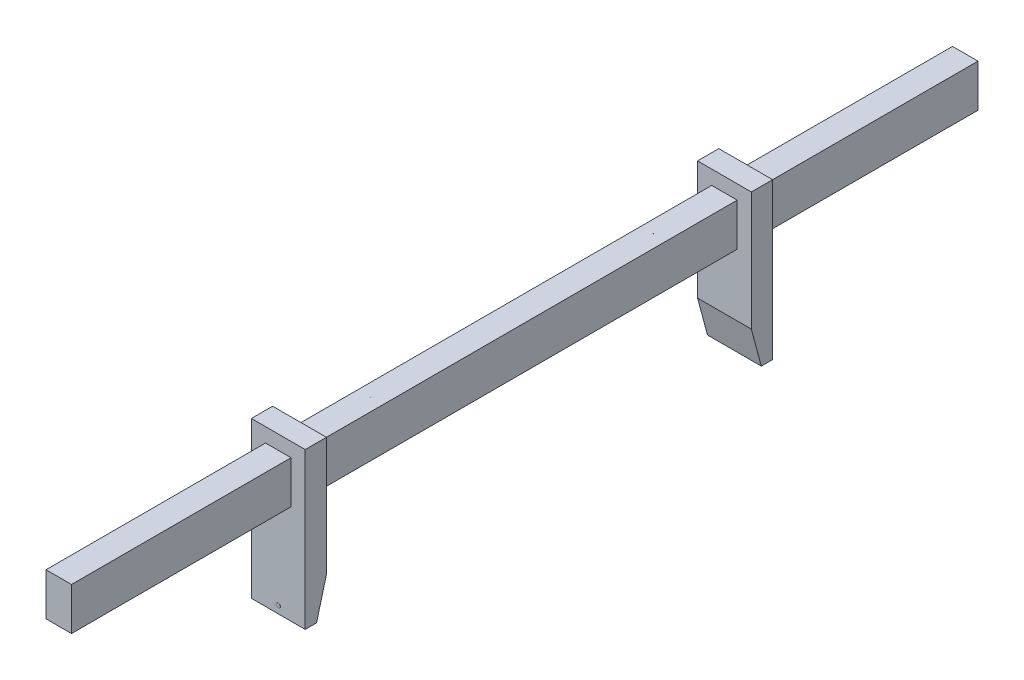
ISO-10303-21;
HEADER;
FILE_DESCRIPTION(('STEP AP214'),'2;1');
FILE_NAME('part.step','',(''),(''),'','','');
FILE_SCHEMA(('AUTOMOTIVE_DESIGN { 1 0 10303 214 1 1 1 1 }'));
ENDSEC;
DATA;
#1=APPLICATION_CONTEXT('core data for automotive mechanical design processes');
#2=APPLICATION_PROTOCOL_DEFINITION('international standard','automotive_design',2000,#1);
#3=PRODUCT_CONTEXT('',#1,'mechanical');
#4=PRODUCT('Part','Part','',(#3));
#5=PRODUCT_RELATED_PRODUCT_CATEGORY('part','',(#4));
#6=PRODUCT_DEFINITION_FORMATION('','',#4);
#7=PRODUCT_DEFINITION_CONTEXT('part definition',#1,'design');
#8=PRODUCT_DEFINITION('design','',#6,#7);
#9=PRODUCT_DEFINITION_SHAPE('','',#8);
#10=(LENGTH_UNIT() NAMED_UNIT(*) SI_UNIT(.MILLI.,.METRE.));
#11=(NAMED_UNIT(*) PLANE_ANGLE_UNIT() SI_UNIT($,.RADIAN.));
#12=(NAMED_UNIT(*) SI_UNIT($,.STERADIAN.) SOLID_ANGLE_UNIT());
#13=UNCERTAINTY_MEASURE_WITH_UNIT(LENGTH_MEASURE(1.E-05),#10,'distance_accuracy_value','');
#14=(GEOMETRIC_REPRESENTATION_CONTEXT(3) GLOBAL_UNCERTAINTY_ASSIGNED_CONTEXT((#13)) GLOBAL_UNIT_ASSIGNED_CONTEXT((#10,
#11,#12)) REPRESENTATION_CONTEXT('',''));
#15=CARTESIAN_POINT('',(0.,0.,0.));
#16=DIRECTION('',(0.,0.,1.));
#17=DIRECTION('',(1.,0.,0.));
#18=AXIS2_PLACEMENT_3D('',#15,#16,#17);
#19=CARTESIAN_POINT('',(9.,-15.,300.));
#20=DIRECTION('',(-1.,0.,0.));
#21=DIRECTION('',(0.,0.,1.));
#22=AXIS2_PLACEMENT_3D('',#19,#20,#21);
#23=PLANE('',#22);
#24=DIRECTION('',(0.,-1.,0.));
#25=VECTOR('',#24,1.);
#26=CARTESIAN_POINT('',(9.,-15.,-150.));
#27=LINE('',#26,#25);
#28=CARTESIAN_POINT('',(9.,15.,-150.));
#29=VERTEX_POINT('',#28);
#30=CARTESIAN_POINT('',(9.,-15.,-150.));
#31=VERTEX_POINT('',#30);
#32=EDGE_CURVE('E64',#29,#31,#27,.T.);
#33=ORIENTED_EDGE('',*,*,#32,.F.);
#34=DIRECTION('',(0.,0.,-1.));
#35=VECTOR('',#34,1.);
#36=CARTESIAN_POINT('',(9.,15.,300.));
#37=LINE('',#36,#35);
#38=CARTESIAN_POINT('',(9.,15.,150.));
#39=VERTEX_POINT('',#38);
#40=EDGE_CURVE('E416',#39,#29,#37,.T.);
#41=ORIENTED_EDGE('',*,*,#40,.F.);
#42=DIRECTION('',(0.,-1.,0.));
#43=VECTOR('',#42,1.);
#44=CARTESIAN_POINT('',(9.,-15.,150.));
#45=LINE('',#44,#43);
#46=CARTESIAN_POINT('',(9.,-15.,150.));
#47=VERTEX_POINT('',#46);
#48=EDGE_CURVE('E339',#39,#47,#45,.T.);
#49=ORIENTED_EDGE('',*,*,#48,.T.);
#50=DIRECTION('',(0.,0.,-1.));
#51=VECTOR('',#50,1.);
#52=CARTESIAN_POINT('',(9.,-15.,300.));
#53=LINE('',#52,#51);
#54=EDGE_CURVE('E401',#47,#31,#53,.T.);
#55=ORIENTED_EDGE('',*,*,#54,.T.);
#56=EDGE_LOOP('',(#33,#41,#49,#55));
#57=FACE_BOUND('',#56,.T.);
#58=ADVANCED_FACE('F41',(#57),#23,.F.);
#59=CARTESIAN_POINT('',(-9.,15.,300.));
#60=DIRECTION('',(0.,-1.,0.));
#61=DIRECTION('',(0.,0.,-1.));
#62=AXIS2_PLACEMENT_3D('',#59,#60,#61);
#63=PLANE('',#62);
#64=CARTESIAN_POINT('',(0.,15.,100.));
#65=DIRECTION('',(0.,-1.,0.));
#66=DIRECTION('',(0.,0.,-1.));
#67=AXIS2_PLACEMENT_3D('',#64,#65,#66);
#68=CIRCLE('',#67,0.25);
#69=CARTESIAN_POINT('',(0.,15.,99.75));
#70=VERTEX_POINT('',#69);
#71=EDGE_CURVE('E612',#70,#70,#68,.T.);
#72=ORIENTED_EDGE('',*,*,#71,.T.);
#73=EDGE_LOOP('',(#72));
#74=FACE_BOUND('',#73,.T.);
#75=CARTESIAN_POINT('',(0.,15.,-100.));
#76=DIRECTION('',(0.,-1.,0.));
#77=DIRECTION('',(0.,0.,-1.));
#78=AXIS2_PLACEMENT_3D('',#75,#76,#77);
#79=CIRCLE('',#78,0.25);
#80=CARTESIAN_POINT('',(0.,15.,-100.25));
#81=VERTEX_POINT('',#80);
#82=EDGE_CURVE('E11',#81,#81,#79,.F.);
#83=ORIENTED_EDGE('',*,*,#82,.F.);
#84=EDGE_LOOP('',(#83));
#85=FACE_BOUND('',#84,.T.);
#86=DIRECTION('',(1.,0.,0.));
#87=VECTOR('',#86,1.);
#88=CARTESIAN_POINT('',(-9.,15.,-150.));
#89=LINE('',#88,#87);
#90=CARTESIAN_POINT('',(-9.,15.,-150.));
#91=VERTEX_POINT('',#90);
#92=EDGE_CURVE('E273',#91,#29,#89,.T.);
#93=ORIENTED_EDGE('',*,*,#92,.F.);
#94=DIRECTION('',(0.,0.,-1.));
#95=VECTOR('',#94,1.);
#96=CARTESIAN_POINT('',(-9.,15.,300.));
#97=LINE('',#96,#95);
#98=CARTESIAN_POINT('',(-9.,15.,150.));
#99=VERTEX_POINT('',#98);
#100=EDGE_CURVE('E411',#99,#91,#97,.T.);
#101=ORIENTED_EDGE('',*,*,#100,.F.);
#102=DIRECTION('',(1.,0.,0.));
#103=VECTOR('',#102,1.);
#104=CARTESIAN_POINT('',(-9.,15.,150.));
#105=LINE('',#104,#103);
#106=EDGE_CURVE('E336',#99,#39,#105,.T.);
#107=ORIENTED_EDGE('',*,*,#106,.T.);
#108=ORIENTED_EDGE('',*,*,#40,.T.);
#109=EDGE_LOOP('',(#93,#101,#107,#108));
#110=FACE_BOUND('',#109,.T.);
#111=ADVANCED_FACE('F445',(#74,#85,#110),#63,.F.);
#112=CARTESIAN_POINT('',(-9.,-15.,300.));
#113=DIRECTION('',(1.,0.,0.));
#114=DIRECTION('',(0.,0.,-1.));
#115=AXIS2_PLACEMENT_3D('',#112,#113,#114);
#116=PLANE('',#115);
#117=DIRECTION('',(0.,1.,0.));
#118=VECTOR('',#117,1.);
#119=CARTESIAN_POINT('',(-9.,-15.,-150.));
#120=LINE('',#119,#118);
#121=CARTESIAN_POINT('',(-9.,-15.,-150.));
#122=VERTEX_POINT('',#121);
#123=EDGE_CURVE('E263',#122,#91,#120,.T.);
#124=ORIENTED_EDGE('',*,*,#123,.F.);
#125=DIRECTION('',(0.,0.,-1.));
#126=VECTOR('',#125,1.);
#127=CARTESIAN_POINT('',(-9.,-15.,300.));
#128=LINE('',#127,#126);
#129=CARTESIAN_POINT('',(-9.,-15.,150.));
#130=VERTEX_POINT('',#129);
#131=EDGE_CURVE('E406',#130,#122,#128,.T.);
#132=ORIENTED_EDGE('',*,*,#131,.F.);
#133=DIRECTION('',(0.,1.,0.));
#134=VECTOR('',#133,1.);
#135=CARTESIAN_POINT('',(-9.,-15.,150.));
#136=LINE('',#135,#134);
#137=EDGE_CURVE('E333',#130,#99,#136,.T.);
#138=ORIENTED_EDGE('',*,*,#137,.T.);
#139=ORIENTED_EDGE('',*,*,#100,.T.);
#140=EDGE_LOOP('',(#124,#132,#138,#139));
#141=FACE_BOUND('',#140,.T.);
#142=ADVANCED_FACE('F442',(#141),#116,.F.);
#143=CARTESIAN_POINT('',(-9.,-15.,300.));
#144=DIRECTION('',(0.,1.,0.));
#145=DIRECTION('',(0.,0.,1.));
#146=AXIS2_PLACEMENT_3D('',#143,#144,#145);
#147=PLANE('',#146);
#148=DIRECTION('',(-1.,0.,0.));
#149=VECTOR('',#148,1.);
#150=CARTESIAN_POINT('',(-9.,-15.,-150.));
#151=LINE('',#150,#149);
#152=EDGE_CURVE('E422',#31,#122,#151,.T.);
#153=ORIENTED_EDGE('',*,*,#152,.F.);
#154=ORIENTED_EDGE('',*,*,#54,.F.);
#155=DIRECTION('',(-1.,0.,0.));
#156=VECTOR('',#155,1.);
#157=CARTESIAN_POINT('',(-9.,-15.,150.));
#158=LINE('',#157,#156);
#159=EDGE_CURVE('E419',#47,#130,#158,.T.);
#160=ORIENTED_EDGE('',*,*,#159,.T.);
#161=ORIENTED_EDGE('',*,*,#131,.T.);
#162=EDGE_LOOP('',(#153,#154,#160,#161));
#163=FACE_BOUND('',#162,.T.);
#164=ADVANCED_FACE('F438',(#163),#147,.F.);
#165=CARTESIAN_POINT('',(-19.,-58.8756443470172,150.));
#166=DIRECTION('',(0.,0.,-1.));
#167=DIRECTION('',(-1.,0.,0.));
#168=AXIS2_PLACEMENT_3D('',#165,#166,#167);
#169=PLANE('',#168);
#170=DIRECTION('',(0.,1.,0.));
#171=VECTOR('',#170,1.);
#172=CARTESIAN_POINT('',(19.,-58.8756443470172,150.));
#173=LINE('',#172,#171);
#174=CARTESIAN_POINT('',(19.,-58.8756443470172,150.));
#175=VERTEX_POINT('',#174);
#176=CARTESIAN_POINT('',(19.,25.,150.));
#177=VERTEX_POINT('',#176);
#178=EDGE_CURVE('E289',#175,#177,#173,.T.);
#179=ORIENTED_EDGE('',*,*,#178,.F.);
#180=DIRECTION('',(1.,0.,0.));
#181=VECTOR('',#180,1.);
#182=CARTESIAN_POINT('',(-19.,-58.8756443470172,150.));
#183=LINE('',#182,#181);
#184=CARTESIAN_POINT('',(-19.,-58.8756443470172,150.));
#185=VERTEX_POINT('',#184);
#186=EDGE_CURVE('E318',#185,#175,#183,.T.);
#187=ORIENTED_EDGE('',*,*,#186,.F.);
#188=DIRECTION('',(0.,1.,0.));
#189=VECTOR('',#188,1.);
#190=CARTESIAN_POINT('',(-19.,-58.8756443470172,150.));
#191=LINE('',#190,#189);
#192=CARTESIAN_POINT('',(-19.,25.,150.));
#193=VERTEX_POINT('',#192);
#194=EDGE_CURVE('E298',#185,#193,#191,.T.);
#195=ORIENTED_EDGE('',*,*,#194,.T.);
#196=DIRECTION('',(1.,0.,0.));
#197=VECTOR('',#196,1.);
#198=CARTESIAN_POINT('',(-19.,25.,150.));
#199=LINE('',#198,#197);
#200=EDGE_CURVE('E315',#193,#177,#199,.T.);
#201=ORIENTED_EDGE('',*,*,#200,.T.);
#202=EDGE_LOOP('',(#179,#187,#195,#201));
#203=FACE_BOUND('',#202,.T.);
#204=ORIENTED_EDGE('',*,*,#48,.F.);
#205=ORIENTED_EDGE('',*,*,#106,.F.);
#206=ORIENTED_EDGE('',*,*,#137,.F.);
#207=ORIENTED_EDGE('',*,*,#159,.F.);
#208=EDGE_LOOP('',(#204,#205,#206,#207));
#209=FACE_BOUND('',#208,.T.);
#210=ADVANCED_FACE('F520',(#203,#209),#169,.T.);
#211=CARTESIAN_POINT('',(-19.,25.,165.));
#212=DIRECTION('',(0.,0.,1.));
#213=DIRECTION('',(1.,0.,0.));
#214=AXIS2_PLACEMENT_3D('',#211,#212,#213);
#215=PLANE('',#214);
#216=CARTESIAN_POINT('',(0.,-79.8368161757076,165.));
#217=DIRECTION('',(0.,0.,1.));
#218=DIRECTION('',(1.,0.,0.));
#219=AXIS2_PLACEMENT_3D('',#216,#217,#218);
#220=CIRCLE('',#219,1.5);
#221=CARTESIAN_POINT('',(1.5,-79.8368161757076,165.));
#222=VERTEX_POINT('',#221);
#223=EDGE_CURVE('E602',#222,#222,#220,.T.);
#224=ORIENTED_EDGE('',*,*,#223,.F.);
#225=EDGE_LOOP('',(#224));
#226=FACE_BOUND('',#225,.T.);
#227=DIRECTION('',(0.,-1.,0.));
#228=VECTOR('',#227,1.);
#229=CARTESIAN_POINT('',(19.,25.,165.));
#230=LINE('',#229,#228);
#231=CARTESIAN_POINT('',(19.,25.,165.));
#232=VERTEX_POINT('',#231);
#233=CARTESIAN_POINT('',(19.,-85.,165.));
#234=VERTEX_POINT('',#233);
#235=EDGE_CURVE('E304',#232,#234,#230,.T.);
#236=ORIENTED_EDGE('',*,*,#235,.F.);
#237=DIRECTION('',(1.,0.,0.));
#238=VECTOR('',#237,1.);
#239=CARTESIAN_POINT('',(-19.,25.,165.));
#240=LINE('',#239,#238);
#241=CARTESIAN_POINT('',(-19.,25.,165.));
#242=VERTEX_POINT('',#241);
#243=EDGE_CURVE('E301',#242,#232,#240,.T.);
#244=ORIENTED_EDGE('',*,*,#243,.F.);
#245=DIRECTION('',(0.,-1.,0.));
#246=VECTOR('',#245,1.);
#247=CARTESIAN_POINT('',(-19.,25.,165.));
#248=LINE('',#247,#246);
#249=CARTESIAN_POINT('',(-19.,-85.,165.));
#250=VERTEX_POINT('',#249);
#251=EDGE_CURVE('E288',#242,#250,#248,.T.);
#252=ORIENTED_EDGE('',*,*,#251,.T.);
#253=DIRECTION('',(1.,0.,0.));
#254=VECTOR('',#253,1.);
#255=CARTESIAN_POINT('',(-19.,-85.,165.));
#256=LINE('',#255,#254);
#257=EDGE_CURVE('E322',#250,#234,#256,.T.);
#258=ORIENTED_EDGE('',*,*,#257,.T.);
#259=EDGE_LOOP('',(#236,#244,#252,#258));
#260=FACE_BOUND('',#259,.T.);
#261=DIRECTION('',(0.,1.,0.));
#262=VECTOR('',#261,1.);
#263=CARTESIAN_POINT('',(9.,-15.,165.));
#264=LINE('',#263,#262);
#265=CARTESIAN_POINT('',(9.,-15.,165.));
#266=VERTEX_POINT('',#265);
#267=CARTESIAN_POINT('',(9.,15.,165.));
#268=VERTEX_POINT('',#267);
#269=EDGE_CURVE('E330',#266,#268,#264,.T.);
#270=ORIENTED_EDGE('',*,*,#269,.F.);
#271=DIRECTION('',(1.,0.,0.));
#272=VECTOR('',#271,1.);
#273=CARTESIAN_POINT('',(-9.,-15.,165.));
#274=LINE('',#273,#272);
#275=CARTESIAN_POINT('',(-9.,-15.,165.));
#276=VERTEX_POINT('',#275);
#277=EDGE_CURVE('E415',#276,#266,#274,.T.);
#278=ORIENTED_EDGE('',*,*,#277,.F.);
#279=DIRECTION('',(0.,-1.,0.));
#280=VECTOR('',#279,1.);
#281=CARTESIAN_POINT('',(-9.,-15.,165.));
#282=LINE('',#281,#280);
#283=CARTESIAN_POINT('',(-9.,15.,165.));
#284=VERTEX_POINT('',#283);
#285=EDGE_CURVE('E317',#284,#276,#282,.T.);
#286=ORIENTED_EDGE('',*,*,#285,.F.);
#287=DIRECTION('',(-1.,0.,0.));
#288=VECTOR('',#287,1.);
#289=CARTESIAN_POINT('',(-9.,15.,165.));
#290=LINE('',#289,#288);
#291=EDGE_CURVE('E327',#268,#284,#290,.T.);
#292=ORIENTED_EDGE('',*,*,#291,.F.);
#293=EDGE_LOOP('',(#270,#278,#286,#292));
#294=FACE_BOUND('',#293,.T.);
#295=ADVANCED_FACE('F517',(#226,#260,#294),#215,.T.);
#296=CARTESIAN_POINT('',(-19.,25.,150.));
#297=DIRECTION('',(0.,1.,0.));
#298=DIRECTION('',(0.,0.,1.));
#299=AXIS2_PLACEMENT_3D('',#296,#297,#298);
#300=PLANE('',#299);
#301=DIRECTION('',(0.,0.,1.));
#302=VECTOR('',#301,1.);
#303=CARTESIAN_POINT('',(19.,25.,150.));
#304=LINE('',#303,#302);
#305=EDGE_CURVE('E284',#177,#232,#304,.T.);
#306=ORIENTED_EDGE('',*,*,#305,.F.);
#307=ORIENTED_EDGE('',*,*,#200,.F.);
#308=DIRECTION('',(0.,0.,1.));
#309=VECTOR('',#308,1.);
#310=CARTESIAN_POINT('',(-19.,25.,150.));
#311=LINE('',#310,#309);
#312=EDGE_CURVE('E285',#193,#242,#311,.T.);
#313=ORIENTED_EDGE('',*,*,#312,.T.);
#314=ORIENTED_EDGE('',*,*,#243,.T.);
#315=EDGE_LOOP('',(#306,#307,#313,#314));
#316=FACE_BOUND('',#315,.T.);
#317=ADVANCED_FACE('F519',(#316),#300,.T.);
#318=CARTESIAN_POINT('',(-19.,-85.,157.));
#319=DIRECTION('',(0.,-0.258819045102514,-0.96592582628907));
#320=DIRECTION('',(0.,0.96592582628907,-0.258819045102514));
#321=AXIS2_PLACEMENT_3D('',#318,#319,#320);
#322=PLANE('',#321);
#323=DIRECTION('',(0.,0.96592582628907,-0.258819045102514));
#324=VECTOR('',#323,1.);
#325=CARTESIAN_POINT('',(19.,-85.,157.));
#326=LINE('',#325,#324);
#327=CARTESIAN_POINT('',(19.,-85.,157.));
#328=VERTEX_POINT('',#327);
#329=EDGE_CURVE('E310',#328,#175,#326,.T.);
#330=ORIENTED_EDGE('',*,*,#329,.F.);
#331=DIRECTION('',(1.,0.,0.));
#332=VECTOR('',#331,1.);
#333=CARTESIAN_POINT('',(-19.,-85.,157.));
#334=LINE('',#333,#332);
#335=CARTESIAN_POINT('',(-19.,-85.,157.));
#336=VERTEX_POINT('',#335);
#337=EDGE_CURVE('E320',#336,#328,#334,.T.);
#338=ORIENTED_EDGE('',*,*,#337,.F.);
#339=DIRECTION('',(0.,0.96592582628907,-0.258819045102514));
#340=VECTOR('',#339,1.);
#341=CARTESIAN_POINT('',(-19.,-85.,157.));
#342=LINE('',#341,#340);
#343=EDGE_CURVE('E295',#336,#185,#342,.T.);
#344=ORIENTED_EDGE('',*,*,#343,.T.);
#345=ORIENTED_EDGE('',*,*,#186,.T.);
#346=EDGE_LOOP('',(#330,#338,#344,#345));
#347=FACE_BOUND('',#346,.T.);
#348=ADVANCED_FACE('F527',(#347),#322,.T.);
#349=CARTESIAN_POINT('',(-19.,-85.,165.));
#350=DIRECTION('',(0.,-1.,0.));
#351=DIRECTION('',(0.,0.,-1.));
#352=AXIS2_PLACEMENT_3D('',#349,#350,#351);
#353=PLANE('',#352);
#354=DIRECTION('',(0.,0.,-1.));
#355=VECTOR('',#354,1.);
#356=CARTESIAN_POINT('',(19.,-85.,165.));
#357=LINE('',#356,#355);
#358=EDGE_CURVE('E307',#234,#328,#357,.T.);
#359=ORIENTED_EDGE('',*,*,#358,.F.);
#360=ORIENTED_EDGE('',*,*,#257,.F.);
#361=DIRECTION('',(0.,0.,-1.));
#362=VECTOR('',#361,1.);
#363=CARTESIAN_POINT('',(-19.,-85.,165.));
#364=LINE('',#363,#362);
#365=EDGE_CURVE('E292',#250,#336,#364,.T.);
#366=ORIENTED_EDGE('',*,*,#365,.T.);
#367=ORIENTED_EDGE('',*,*,#337,.T.);
#368=EDGE_LOOP('',(#359,#360,#366,#367));
#369=FACE_BOUND('',#368,.T.);
#370=ADVANCED_FACE('F535',(#369),#353,.T.);
#371=CARTESIAN_POINT('',(-19.,0.,0.));
#372=DIRECTION('',(1.,0.,0.));
#373=DIRECTION('',(0.,0.,-1.));
#374=AXIS2_PLACEMENT_3D('',#371,#372,#373);
#375=PLANE('',#374);
#376=ORIENTED_EDGE('',*,*,#312,.F.);
#377=ORIENTED_EDGE('',*,*,#194,.F.);
#378=ORIENTED_EDGE('',*,*,#343,.F.);
#379=ORIENTED_EDGE('',*,*,#365,.F.);
#380=ORIENTED_EDGE('',*,*,#251,.F.);
#381=EDGE_LOOP('',(#376,#377,#378,#379,#380));
#382=FACE_BOUND('',#381,.T.);
#383=ADVANCED_FACE('F538',(#382),#375,.F.);
#384=CARTESIAN_POINT('',(19.,0.,0.));
#385=DIRECTION('',(1.,0.,0.));
#386=DIRECTION('',(0.,0.,-1.));
#387=AXIS2_PLACEMENT_3D('',#384,#385,#386);
#388=PLANE('',#387);
#389=ORIENTED_EDGE('',*,*,#305,.T.);
#390=ORIENTED_EDGE('',*,*,#235,.T.);
#391=ORIENTED_EDGE('',*,*,#358,.T.);
#392=ORIENTED_EDGE('',*,*,#329,.T.);
#393=ORIENTED_EDGE('',*,*,#178,.T.);
#394=EDGE_LOOP('',(#389,#390,#391,#392,#393));
#395=FACE_BOUND('',#394,.T.);
#396=ADVANCED_FACE('F543',(#395),#388,.T.);
#397=CARTESIAN_POINT('',(0.,0.,320.));
#398=DIRECTION('',(0.,0.,-1.));
#399=DIRECTION('',(-1.,0.,0.));
#400=AXIS2_PLACEMENT_3D('',#397,#398,#399);
#401=PLANE('',#400);
#402=DIRECTION('',(0.,-1.,0.));
#403=VECTOR('',#402,1.);
#404=CARTESIAN_POINT('',(-9.,-15.,320.));
#405=LINE('',#404,#403);
#406=CARTESIAN_POINT('',(-9.,15.,320.));
#407=VERTEX_POINT('',#406);
#408=CARTESIAN_POINT('',(-9.,-15.05,320.));
#409=VERTEX_POINT('',#408);
#410=EDGE_CURVE('E367',#407,#409,#405,.T.);
#411=ORIENTED_EDGE('',*,*,#410,.T.);
#412=DIRECTION('',(1.,0.,0.));
#413=VECTOR('',#412,1.);
#414=CARTESIAN_POINT('',(-9.,-15.05,320.));
#415=LINE('',#414,#413);
#416=CARTESIAN_POINT('',(9.,-15.05,320.));
#417=VERTEX_POINT('',#416);
#418=EDGE_CURVE('E369',#409,#417,#415,.T.);
#419=ORIENTED_EDGE('',*,*,#418,.T.);
#420=DIRECTION('',(0.,1.,0.));
#421=VECTOR('',#420,1.);
#422=CARTESIAN_POINT('',(9.,-15.05,320.));
#423=LINE('',#422,#421);
#424=CARTESIAN_POINT('',(9.,15.,320.));
#425=VERTEX_POINT('',#424);
#426=EDGE_CURVE('E372',#417,#425,#423,.T.);
#427=ORIENTED_EDGE('',*,*,#426,.T.);
#428=DIRECTION('',(-1.,0.,0.));
#429=VECTOR('',#428,1.);
#430=CARTESIAN_POINT('',(-9.,15.,320.));
#431=LINE('',#430,#429);
#432=EDGE_CURVE('E375',#425,#407,#431,.T.);
#433=ORIENTED_EDGE('',*,*,#432,.T.);
#434=EDGE_LOOP('',(#411,#419,#427,#433));
#435=FACE_BOUND('',#434,.T.);
#436=ADVANCED_FACE('F503',(#435),#401,.F.);
#437=CARTESIAN_POINT('',(-9.,-15.05,320.));
#438=DIRECTION('',(0.,1.,0.));
#439=DIRECTION('',(0.,0.,1.));
#440=AXIS2_PLACEMENT_3D('',#437,#438,#439);
#441=PLANE('',#440);
#442=DIRECTION('',(1.,0.,0.));
#443=VECTOR('',#442,1.);
#444=CARTESIAN_POINT('',(-9.,-15.05,300.));
#445=LINE('',#444,#443);
#446=CARTESIAN_POINT('',(-9.,-15.05,300.));
#447=VERTEX_POINT('',#446);
#448=CARTESIAN_POINT('',(9.,-15.05,300.));
#449=VERTEX_POINT('',#448);
#450=EDGE_CURVE('E380',#447,#449,#445,.T.);
#451=ORIENTED_EDGE('',*,*,#450,.T.);
#452=DIRECTION('',(0.,0.,-1.));
#453=VECTOR('',#452,1.);
#454=CARTESIAN_POINT('',(9.,-15.05,320.));
#455=LINE('',#454,#453);
#456=EDGE_CURVE('E378',#417,#449,#455,.T.);
#457=ORIENTED_EDGE('',*,*,#456,.F.);
#458=ORIENTED_EDGE('',*,*,#418,.F.);
#459=DIRECTION('',(0.,0.,-1.));
#460=VECTOR('',#459,1.);
#461=CARTESIAN_POINT('',(-9.,-15.05,320.));
#462=LINE('',#461,#460);
#463=EDGE_CURVE('E387',#409,#447,#462,.T.);
#464=ORIENTED_EDGE('',*,*,#463,.T.);
#465=EDGE_LOOP('',(#451,#457,#458,#464));
#466=FACE_BOUND('',#465,.T.);
#467=ADVANCED_FACE('F509',(#466),#441,.F.);
#468=CARTESIAN_POINT('',(0.,0.,300.));
#469=DIRECTION('',(0.,0.,-1.));
#470=DIRECTION('',(-1.,0.,0.));
#471=AXIS2_PLACEMENT_3D('',#468,#469,#470);
#472=PLANE('',#471);
#473=DIRECTION('',(0.,-1.,0.));
#474=VECTOR('',#473,1.);
#475=CARTESIAN_POINT('',(-9.,-15.,300.));
#476=LINE('',#475,#474);
#477=CARTESIAN_POINT('',(-9.,-15.,300.));
#478=VERTEX_POINT('',#477);
#479=EDGE_CURVE('E366',#478,#447,#476,.T.);
#480=ORIENTED_EDGE('',*,*,#479,.F.);
#481=DIRECTION('',(1.,0.,0.));
#482=VECTOR('',#481,1.);
#483=CARTESIAN_POINT('',(-9.,-15.,300.));
#484=LINE('',#483,#482);
#485=CARTESIAN_POINT('',(9.,-15.,300.));
#486=VERTEX_POINT('',#485);
#487=EDGE_CURVE('E391',#478,#486,#484,.T.);
#488=ORIENTED_EDGE('',*,*,#487,.T.);
#489=DIRECTION('',(0.,1.,0.));
#490=VECTOR('',#489,1.);
#491=CARTESIAN_POINT('',(9.,15.,300.));
#492=LINE('',#491,#490);
#493=EDGE_CURVE('E370',#449,#486,#492,.T.);
#494=ORIENTED_EDGE('',*,*,#493,.F.);
#495=ORIENTED_EDGE('',*,*,#450,.F.);
#496=EDGE_LOOP('',(#480,#488,#494,#495));
#497=FACE_BOUND('',#496,.T.);
#498=ADVANCED_FACE('F513',(#497),#472,.T.);
#499=EDGE_CURVE('E402',#478,#276,#128,.T.);
#500=ORIENTED_EDGE('',*,*,#499,.T.);
#501=ORIENTED_EDGE('',*,*,#277,.T.);
#502=EDGE_CURVE('E397',#486,#266,#53,.T.);
#503=ORIENTED_EDGE('',*,*,#502,.F.);
#504=ORIENTED_EDGE('',*,*,#487,.F.);
#505=EDGE_LOOP('',(#500,#501,#503,#504));
#506=FACE_BOUND('',#505,.T.);
#507=ADVANCED_FACE('F469',(#506),#147,.F.);
#508=EDGE_CURVE('E407',#407,#284,#97,.T.);
#509=ORIENTED_EDGE('',*,*,#508,.T.);
#510=ORIENTED_EDGE('',*,*,#285,.T.);
#511=ORIENTED_EDGE('',*,*,#499,.F.);
#512=ORIENTED_EDGE('',*,*,#479,.T.);
#513=ORIENTED_EDGE('',*,*,#463,.F.);
#514=ORIENTED_EDGE('',*,*,#410,.F.);
#515=EDGE_LOOP('',(#509,#510,#511,#512,#513,#514));
#516=FACE_BOUND('',#515,.T.);
#517=ADVANCED_FACE('F493',(#516),#116,.F.);
#518=EDGE_CURVE('E412',#425,#268,#37,.T.);
#519=ORIENTED_EDGE('',*,*,#518,.T.);
#520=ORIENTED_EDGE('',*,*,#291,.T.);
#521=ORIENTED_EDGE('',*,*,#508,.F.);
#522=ORIENTED_EDGE('',*,*,#432,.F.);
#523=EDGE_LOOP('',(#519,#520,#521,#522));
#524=FACE_BOUND('',#523,.T.);
#525=ADVANCED_FACE('F477',(#524),#63,.F.);
#526=ORIENTED_EDGE('',*,*,#502,.T.);
#527=ORIENTED_EDGE('',*,*,#269,.T.);
#528=ORIENTED_EDGE('',*,*,#518,.F.);
#529=ORIENTED_EDGE('',*,*,#426,.F.);
#530=ORIENTED_EDGE('',*,*,#456,.T.);
#531=ORIENTED_EDGE('',*,*,#493,.T.);
#532=EDGE_LOOP('',(#526,#527,#528,#529,#530,#531));
#533=FACE_BOUND('',#532,.T.);
#534=ADVANCED_FACE('F43',(#533),#23,.F.);
#535=CARTESIAN_POINT('',(-19.,25.,-165.));
#536=DIRECTION('',(0.,0.,1.));
#537=DIRECTION('',(1.,0.,0.));
#538=AXIS2_PLACEMENT_3D('',#535,#536,#537);
#539=PLANE('',#538);
#540=CARTESIAN_POINT('',(0.,-79.8368161757076,-165.));
#541=DIRECTION('',(0.,0.,1.));
#542=DIRECTION('',(1.,0.,0.));
#543=AXIS2_PLACEMENT_3D('',#540,#541,#542);
#544=CIRCLE('',#543,1.5);
#545=CARTESIAN_POINT('',(1.5,-79.8368161757076,-165.));
#546=VERTEX_POINT('',#545);
#547=EDGE_CURVE('E603',#546,#546,#544,.T.);
#548=ORIENTED_EDGE('',*,*,#547,.T.);
#549=EDGE_LOOP('',(#548));
#550=FACE_BOUND('',#549,.T.);
#551=DIRECTION('',(0.,-1.,0.));
#552=VECTOR('',#551,1.);
#553=CARTESIAN_POINT('',(19.,25.,-165.));
#554=LINE('',#553,#552);
#555=CARTESIAN_POINT('',(19.,25.,-165.));
#556=VERTEX_POINT('',#555);
#557=CARTESIAN_POINT('',(19.,-85.,-165.));
#558=VERTEX_POINT('',#557);
#559=EDGE_CURVE('E244',#556,#558,#554,.T.);
#560=ORIENTED_EDGE('',*,*,#559,.T.);
#561=DIRECTION('',(1.,0.,0.));
#562=VECTOR('',#561,1.);
#563=CARTESIAN_POINT('',(-19.,-85.,-165.));
#564=LINE('',#563,#562);
#565=CARTESIAN_POINT('',(-19.,-85.,-165.));
#566=VERTEX_POINT('',#565);
#567=EDGE_CURVE('E264',#566,#558,#564,.T.);
#568=ORIENTED_EDGE('',*,*,#567,.F.);
#569=DIRECTION('',(0.,-1.,0.));
#570=VECTOR('',#569,1.);
#571=CARTESIAN_POINT('',(-19.,25.,-165.));
#572=LINE('',#571,#570);
#573=CARTESIAN_POINT('',(-19.,25.,-165.));
#574=VERTEX_POINT('',#573);
#575=EDGE_CURVE('E239',#574,#566,#572,.T.);
#576=ORIENTED_EDGE('',*,*,#575,.F.);
#577=DIRECTION('',(1.,0.,0.));
#578=VECTOR('',#577,1.);
#579=CARTESIAN_POINT('',(-19.,25.,-165.));
#580=LINE('',#579,#578);
#581=EDGE_CURVE('E243',#574,#556,#580,.T.);
#582=ORIENTED_EDGE('',*,*,#581,.T.);
#583=EDGE_LOOP('',(#560,#568,#576,#582));
#584=FACE_BOUND('',#583,.T.);
#585=DIRECTION('',(1.,0.,0.));
#586=VECTOR('',#585,1.);
#587=CARTESIAN_POINT('',(-9.,-15.,-165.));
#588=LINE('',#587,#586);
#589=CARTESIAN_POINT('',(-9.,-15.,-165.));
#590=VERTEX_POINT('',#589);
#591=CARTESIAN_POINT('',(9.,-15.,-165.));
#592=VERTEX_POINT('',#591);
#593=EDGE_CURVE('E49',#590,#592,#588,.T.);
#594=ORIENTED_EDGE('',*,*,#593,.T.);
#595=DIRECTION('',(0.,1.,0.));
#596=VECTOR('',#595,1.);
#597=CARTESIAN_POINT('',(9.,-15.,-165.));
#598=LINE('',#597,#596);
#599=CARTESIAN_POINT('',(9.,15.,-165.));
#600=VERTEX_POINT('',#599);
#601=EDGE_CURVE('E281',#592,#600,#598,.T.);
#602=ORIENTED_EDGE('',*,*,#601,.T.);
#603=DIRECTION('',(-1.,0.,0.));
#604=VECTOR('',#603,1.);
#605=CARTESIAN_POINT('',(-9.,15.,-165.));
#606=LINE('',#605,#604);
#607=CARTESIAN_POINT('',(-9.,15.,-165.));
#608=VERTEX_POINT('',#607);
#609=EDGE_CURVE('E56',#600,#608,#606,.T.);
#610=ORIENTED_EDGE('',*,*,#609,.T.);
#611=DIRECTION('',(0.,-1.,0.));
#612=VECTOR('',#611,1.);
#613=CARTESIAN_POINT('',(-9.,-15.,-165.));
#614=LINE('',#613,#612);
#615=EDGE_CURVE('E277',#608,#590,#614,.T.);
#616=ORIENTED_EDGE('',*,*,#615,.T.);
#617=EDGE_LOOP('',(#594,#602,#610,#616));
#618=FACE_BOUND('',#617,.T.);
#619=ADVANCED_FACE('F426',(#550,#584,#618),#539,.F.);
#620=CARTESIAN_POINT('',(-19.,-58.8756443470172,-150.));
#621=DIRECTION('',(0.,0.,-1.));
#622=DIRECTION('',(-1.,0.,0.));
#623=AXIS2_PLACEMENT_3D('',#620,#621,#622);
#624=PLANE('',#623);
#625=DIRECTION('',(0.,1.,0.));
#626=VECTOR('',#625,1.);
#627=CARTESIAN_POINT('',(19.,-58.8756443470172,-150.));
#628=LINE('',#627,#626);
#629=CARTESIAN_POINT('',(19.,-58.8756443470172,-150.));
#630=VERTEX_POINT('',#629);
#631=CARTESIAN_POINT('',(19.,25.,-150.));
#632=VERTEX_POINT('',#631);
#633=EDGE_CURVE('E234',#630,#632,#628,.T.);
#634=ORIENTED_EDGE('',*,*,#633,.T.);
#635=DIRECTION('',(1.,0.,0.));
#636=VECTOR('',#635,1.);
#637=CARTESIAN_POINT('',(-19.,25.,-150.));
#638=LINE('',#637,#636);
#639=CARTESIAN_POINT('',(-19.,25.,-150.));
#640=VERTEX_POINT('',#639);
#641=EDGE_CURVE('E230',#640,#632,#638,.T.);
#642=ORIENTED_EDGE('',*,*,#641,.F.);
#643=DIRECTION('',(0.,1.,0.));
#644=VECTOR('',#643,1.);
#645=CARTESIAN_POINT('',(-19.,-58.8756443470172,-150.));
#646=LINE('',#645,#644);
#647=CARTESIAN_POINT('',(-19.,-58.8756443470172,-150.));
#648=VERTEX_POINT('',#647);
#649=EDGE_CURVE('E217',#648,#640,#646,.T.);
#650=ORIENTED_EDGE('',*,*,#649,.F.);
#651=DIRECTION('',(1.,0.,0.));
#652=VECTOR('',#651,1.);
#653=CARTESIAN_POINT('',(-19.,-58.8756443470172,-150.));
#654=LINE('',#653,#652);
#655=EDGE_CURVE('E238',#648,#630,#654,.T.);
#656=ORIENTED_EDGE('',*,*,#655,.T.);
#657=EDGE_LOOP('',(#634,#642,#650,#656));
#658=FACE_BOUND('',#657,.T.);
#659=ORIENTED_EDGE('',*,*,#92,.T.);
#660=ORIENTED_EDGE('',*,*,#32,.T.);
#661=ORIENTED_EDGE('',*,*,#152,.T.);
#662=ORIENTED_EDGE('',*,*,#123,.T.);
#663=EDGE_LOOP('',(#659,#660,#661,#662));
#664=FACE_BOUND('',#663,.T.);
#665=ADVANCED_FACE('F231',(#658,#664),#624,.F.);
#666=CARTESIAN_POINT('',(-19.,25.,-150.));
#667=DIRECTION('',(0.,-1.,0.));
#668=DIRECTION('',(0.,0.,-1.));
#669=AXIS2_PLACEMENT_3D('',#666,#667,#668);
#670=PLANE('',#669);
#671=DIRECTION('',(0.,0.,-1.));
#672=VECTOR('',#671,1.);
#673=CARTESIAN_POINT('',(19.,25.,-150.));
#674=LINE('',#673,#672);
#675=EDGE_CURVE('E256',#632,#556,#674,.T.);
#676=ORIENTED_EDGE('',*,*,#675,.T.);
#677=ORIENTED_EDGE('',*,*,#581,.F.);
#678=DIRECTION('',(0.,0.,-1.));
#679=VECTOR('',#678,1.);
#680=CARTESIAN_POINT('',(-19.,25.,-150.));
#681=LINE('',#680,#679);
#682=EDGE_CURVE('E221',#640,#574,#681,.T.);
#683=ORIENTED_EDGE('',*,*,#682,.F.);
#684=ORIENTED_EDGE('',*,*,#641,.T.);
#685=EDGE_LOOP('',(#676,#677,#683,#684));
#686=FACE_BOUND('',#685,.T.);
#687=ADVANCED_FACE('F241',(#686),#670,.F.);
#688=CARTESIAN_POINT('',(-19.,-85.,-165.));
#689=DIRECTION('',(0.,1.,0.));
#690=DIRECTION('',(0.,0.,1.));
#691=AXIS2_PLACEMENT_3D('',#688,#689,#690);
#692=PLANE('',#691);
#693=DIRECTION('',(0.,0.,1.));
#694=VECTOR('',#693,1.);
#695=CARTESIAN_POINT('',(19.,-85.,-165.));
#696=LINE('',#695,#694);
#697=CARTESIAN_POINT('',(19.,-85.,-157.));
#698=VERTEX_POINT('',#697);
#699=EDGE_CURVE('E246',#558,#698,#696,.T.);
#700=ORIENTED_EDGE('',*,*,#699,.T.);
#701=DIRECTION('',(1.,0.,0.));
#702=VECTOR('',#701,1.);
#703=CARTESIAN_POINT('',(-19.,-85.,-157.));
#704=LINE('',#703,#702);
#705=CARTESIAN_POINT('',(-19.,-85.,-157.));
#706=VERTEX_POINT('',#705);
#707=EDGE_CURVE('E267',#706,#698,#704,.T.);
#708=ORIENTED_EDGE('',*,*,#707,.F.);
#709=DIRECTION('',(0.,0.,1.));
#710=VECTOR('',#709,1.);
#711=CARTESIAN_POINT('',(-19.,-85.,-165.));
#712=LINE('',#711,#710);
#713=EDGE_CURVE('E253',#566,#706,#712,.T.);
#714=ORIENTED_EDGE('',*,*,#713,.F.);
#715=ORIENTED_EDGE('',*,*,#567,.T.);
#716=EDGE_LOOP('',(#700,#708,#714,#715));
#717=FACE_BOUND('',#716,.T.);
#718=ADVANCED_FACE('F552',(#717),#692,.F.);
#719=CARTESIAN_POINT('',(-19.,-85.,-157.));
#720=DIRECTION('',(0.,0.258819045102514,-0.96592582628907));
#721=DIRECTION('',(0.,0.96592582628907,0.258819045102514));
#722=AXIS2_PLACEMENT_3D('',#719,#720,#721);
#723=PLANE('',#722);
#724=DIRECTION('',(0.,0.96592582628907,0.258819045102514));
#725=VECTOR('',#724,1.);
#726=CARTESIAN_POINT('',(19.,-85.,-157.));
#727=LINE('',#726,#725);
#728=EDGE_CURVE('E259',#698,#630,#727,.T.);
#729=ORIENTED_EDGE('',*,*,#728,.T.);
#730=ORIENTED_EDGE('',*,*,#655,.F.);
#731=DIRECTION('',(0.,0.96592582628907,0.258819045102514));
#732=VECTOR('',#731,1.);
#733=CARTESIAN_POINT('',(-19.,-85.,-157.));
#734=LINE('',#733,#732);
#735=EDGE_CURVE('E224',#706,#648,#734,.T.);
#736=ORIENTED_EDGE('',*,*,#735,.F.);
#737=ORIENTED_EDGE('',*,*,#707,.T.);
#738=EDGE_LOOP('',(#729,#730,#736,#737));
#739=FACE_BOUND('',#738,.T.);
#740=ADVANCED_FACE('F555',(#739),#723,.F.);
#741=CARTESIAN_POINT('',(-19.,0.,0.));
#742=DIRECTION('',(1.,0.,0.));
#743=DIRECTION('',(0.,0.,1.));
#744=AXIS2_PLACEMENT_3D('',#741,#742,#743);
#745=PLANE('',#744);
#746=ORIENTED_EDGE('',*,*,#682,.T.);
#747=ORIENTED_EDGE('',*,*,#575,.T.);
#748=ORIENTED_EDGE('',*,*,#713,.T.);
#749=ORIENTED_EDGE('',*,*,#735,.T.);
#750=ORIENTED_EDGE('',*,*,#649,.T.);
#751=EDGE_LOOP('',(#746,#747,#748,#749,#750));
#752=FACE_BOUND('',#751,.T.);
#753=ADVANCED_FACE('F219',(#752),#745,.F.);
#754=CARTESIAN_POINT('',(19.,0.,0.));
#755=DIRECTION('',(1.,0.,0.));
#756=DIRECTION('',(0.,0.,1.));
#757=AXIS2_PLACEMENT_3D('',#754,#755,#756);
#758=PLANE('',#757);
#759=ORIENTED_EDGE('',*,*,#675,.F.);
#760=ORIENTED_EDGE('',*,*,#633,.F.);
#761=ORIENTED_EDGE('',*,*,#728,.F.);
#762=ORIENTED_EDGE('',*,*,#699,.F.);
#763=ORIENTED_EDGE('',*,*,#559,.F.);
#764=EDGE_LOOP('',(#759,#760,#761,#762,#763));
#765=FACE_BOUND('',#764,.T.);
#766=ADVANCED_FACE('F565',(#765),#758,.T.);
#767=CARTESIAN_POINT('',(-9.,-15.05,-320.));
#768=DIRECTION('',(0.,-1.,0.));
#769=DIRECTION('',(0.,0.,-1.));
#770=AXIS2_PLACEMENT_3D('',#767,#768,#769);
#771=PLANE('',#770);
#772=DIRECTION('',(1.,0.,0.));
#773=VECTOR('',#772,1.);
#774=CARTESIAN_POINT('',(-9.,-15.05,-300.));
#775=LINE('',#774,#773);
#776=CARTESIAN_POINT('',(-9.,-15.05,-300.));
#777=VERTEX_POINT('',#776);
#778=CARTESIAN_POINT('',(9.,-15.05,-300.));
#779=VERTEX_POINT('',#778);
#780=EDGE_CURVE('E358',#777,#779,#775,.T.);
#781=ORIENTED_EDGE('',*,*,#780,.F.);
#782=DIRECTION('',(0.,0.,1.));
#783=VECTOR('',#782,1.);
#784=CARTESIAN_POINT('',(-9.,-15.05,-320.));
#785=LINE('',#784,#783);
#786=CARTESIAN_POINT('',(-9.,-15.05,-320.));
#787=VERTEX_POINT('',#786);
#788=EDGE_CURVE('E355',#787,#777,#785,.T.);
#789=ORIENTED_EDGE('',*,*,#788,.F.);
#790=DIRECTION('',(1.,0.,0.));
#791=VECTOR('',#790,1.);
#792=CARTESIAN_POINT('',(-9.,-15.05,-320.));
#793=LINE('',#792,#791);
#794=CARTESIAN_POINT('',(9.,-15.05,-320.));
#795=VERTEX_POINT('',#794);
#796=EDGE_CURVE('E352',#787,#795,#793,.T.);
#797=ORIENTED_EDGE('',*,*,#796,.T.);
#798=DIRECTION('',(0.,0.,1.));
#799=VECTOR('',#798,1.);
#800=CARTESIAN_POINT('',(9.,-15.05,-320.));
#801=LINE('',#800,#799);
#802=EDGE_CURVE('E364',#795,#779,#801,.T.);
#803=ORIENTED_EDGE('',*,*,#802,.T.);
#804=EDGE_LOOP('',(#781,#789,#797,#803));
#805=FACE_BOUND('',#804,.T.);
#806=ADVANCED_FACE('F459',(#805),#771,.T.);
#807=CARTESIAN_POINT('',(0.,0.,-320.));
#808=DIRECTION('',(0.,0.,1.));
#809=DIRECTION('',(-1.,0.,0.));
#810=AXIS2_PLACEMENT_3D('',#807,#808,#809);
#811=PLANE('',#810);
#812=DIRECTION('',(0.,-1.,0.));
#813=VECTOR('',#812,1.);
#814=CARTESIAN_POINT('',(-9.,-15.,-320.));
#815=LINE('',#814,#813);
#816=CARTESIAN_POINT('',(-9.,15.,-320.));
#817=VERTEX_POINT('',#816);
#818=EDGE_CURVE('E343',#817,#787,#815,.T.);
#819=ORIENTED_EDGE('',*,*,#818,.F.);
#820=DIRECTION('',(-1.,0.,0.));
#821=VECTOR('',#820,1.);
#822=CARTESIAN_POINT('',(-9.,15.,-320.));
#823=LINE('',#822,#821);
#824=CARTESIAN_POINT('',(9.,15.,-320.));
#825=VERTEX_POINT('',#824);
#826=EDGE_CURVE('E345',#825,#817,#823,.T.);
#827=ORIENTED_EDGE('',*,*,#826,.F.);
#828=DIRECTION('',(0.,1.,0.));
#829=VECTOR('',#828,1.);
#830=CARTESIAN_POINT('',(9.,15.,-320.));
#831=LINE('',#830,#829);
#832=EDGE_CURVE('E349',#795,#825,#831,.T.);
#833=ORIENTED_EDGE('',*,*,#832,.F.);
#834=ORIENTED_EDGE('',*,*,#796,.F.);
#835=EDGE_LOOP('',(#819,#827,#833,#834));
#836=FACE_BOUND('',#835,.T.);
#837=ADVANCED_FACE('F451',(#836),#811,.F.);
#838=CARTESIAN_POINT('',(0.,0.,-300.));
#839=DIRECTION('',(0.,0.,1.));
#840=DIRECTION('',(-1.,0.,0.));
#841=AXIS2_PLACEMENT_3D('',#838,#839,#840);
#842=PLANE('',#841);
#843=DIRECTION('',(1.,0.,0.));
#844=VECTOR('',#843,1.);
#845=CARTESIAN_POINT('',(-9.,-15.,-300.));
#846=LINE('',#845,#844);
#847=CARTESIAN_POINT('',(-9.,-15.,-300.));
#848=VERTEX_POINT('',#847);
#849=CARTESIAN_POINT('',(9.,-15.,-300.));
#850=VERTEX_POINT('',#849);
#851=EDGE_CURVE('E390',#848,#850,#846,.T.);
#852=ORIENTED_EDGE('',*,*,#851,.F.);
#853=DIRECTION('',(0.,-1.,0.));
#854=VECTOR('',#853,1.);
#855=CARTESIAN_POINT('',(-9.,-15.,-300.));
#856=LINE('',#855,#854);
#857=EDGE_CURVE('E346',#848,#777,#856,.T.);
#858=ORIENTED_EDGE('',*,*,#857,.T.);
#859=ORIENTED_EDGE('',*,*,#780,.T.);
#860=DIRECTION('',(0.,1.,0.));
#861=VECTOR('',#860,1.);
#862=CARTESIAN_POINT('',(9.,-15.05,-300.));
#863=LINE('',#862,#861);
#864=EDGE_CURVE('E342',#779,#850,#863,.T.);
#865=ORIENTED_EDGE('',*,*,#864,.T.);
#866=EDGE_LOOP('',(#852,#858,#859,#865));
#867=FACE_BOUND('',#866,.T.);
#868=ADVANCED_FACE('F461',(#867),#842,.T.);
#869=ORIENTED_EDGE('',*,*,#593,.F.);
#870=EDGE_CURVE('E400',#590,#848,#128,.T.);
#871=ORIENTED_EDGE('',*,*,#870,.T.);
#872=ORIENTED_EDGE('',*,*,#851,.T.);
#873=EDGE_CURVE('E394',#592,#850,#53,.T.);
#874=ORIENTED_EDGE('',*,*,#873,.F.);
#875=EDGE_LOOP('',(#869,#871,#872,#874));
#876=FACE_BOUND('',#875,.T.);
#877=ADVANCED_FACE('F430',(#876),#147,.F.);
#878=ORIENTED_EDGE('',*,*,#615,.F.);
#879=EDGE_CURVE('E405',#608,#817,#97,.T.);
#880=ORIENTED_EDGE('',*,*,#879,.T.);
#881=ORIENTED_EDGE('',*,*,#818,.T.);
#882=ORIENTED_EDGE('',*,*,#788,.T.);
#883=ORIENTED_EDGE('',*,*,#857,.F.);
#884=ORIENTED_EDGE('',*,*,#870,.F.);
#885=EDGE_LOOP('',(#878,#880,#881,#882,#883,#884));
#886=FACE_BOUND('',#885,.T.);
#887=ADVANCED_FACE('F434',(#886),#116,.F.);
#888=ORIENTED_EDGE('',*,*,#609,.F.);
#889=EDGE_CURVE('E410',#600,#825,#37,.T.);
#890=ORIENTED_EDGE('',*,*,#889,.T.);
#891=ORIENTED_EDGE('',*,*,#826,.T.);
#892=ORIENTED_EDGE('',*,*,#879,.F.);
#893=EDGE_LOOP('',(#888,#890,#891,#892));
#894=FACE_BOUND('',#893,.T.);
#895=ADVANCED_FACE('F447',(#894),#63,.F.);
#896=ORIENTED_EDGE('',*,*,#601,.F.);
#897=ORIENTED_EDGE('',*,*,#873,.T.);
#898=ORIENTED_EDGE('',*,*,#864,.F.);
#899=ORIENTED_EDGE('',*,*,#802,.F.);
#900=ORIENTED_EDGE('',*,*,#832,.T.);
#901=ORIENTED_EDGE('',*,*,#889,.F.);
#902=EDGE_LOOP('',(#896,#897,#898,#899,#900,#901));
#903=FACE_BOUND('',#902,.T.);
#904=ADVANCED_FACE('F454',(#903),#23,.F.);
#905=CARTESIAN_POINT('',(0.,15.05,-100.));
#906=DIRECTION('',(0.,-1.,0.));
#907=DIRECTION('',(0.,0.,-1.));
#908=AXIS2_PLACEMENT_3D('',#905,#906,#907);
#909=CYLINDRICAL_SURFACE('',#908,0.25);
#910=CARTESIAN_POINT('',(0.,15.05,-100.));
#911=DIRECTION('',(0.,1.,0.));
#912=DIRECTION('',(0.,0.,1.));
#913=AXIS2_PLACEMENT_3D('',#910,#911,#912);
#914=CIRCLE('',#913,0.25);
#915=CARTESIAN_POINT('',(0.,15.05,-99.75));
#916=VERTEX_POINT('',#915);
#917=EDGE_CURVE('E249',#916,#916,#914,.T.);
#918=ORIENTED_EDGE('',*,*,#917,.F.);
#919=EDGE_LOOP('',(#918));
#920=FACE_BOUND('',#919,.T.);
#921=ORIENTED_EDGE('',*,*,#82,.T.);
#922=EDGE_LOOP('',(#921));
#923=FACE_BOUND('',#922,.T.);
#924=ADVANCED_FACE('F481',(#920,#923),#909,.T.);
#925=CARTESIAN_POINT('',(0.,15.05,-100.));
#926=DIRECTION('',(0.,1.,0.));
#927=DIRECTION('',(0.,0.,1.));
#928=AXIS2_PLACEMENT_3D('',#925,#926,#927);
#929=PLANE('',#928);
#930=ORIENTED_EDGE('',*,*,#917,.T.);
#931=EDGE_LOOP('',(#930));
#932=FACE_BOUND('',#931,.T.);
#933=ADVANCED_FACE('F486',(#932),#929,.T.);
#934=CARTESIAN_POINT('',(0.,15.05,100.));
#935=DIRECTION('',(0.,-1.,0.));
#936=DIRECTION('',(0.,0.,-1.));
#937=AXIS2_PLACEMENT_3D('',#934,#935,#936);
#938=CYLINDRICAL_SURFACE('',#937,0.25);
#939=CARTESIAN_POINT('',(0.,15.05,100.));
#940=DIRECTION('',(0.,-1.,0.));
#941=DIRECTION('',(0.,0.,-1.));
#942=AXIS2_PLACEMENT_3D('',#939,#940,#941);
#943=CIRCLE('',#942,0.25);
#944=CARTESIAN_POINT('',(0.,15.05,99.75));
#945=VERTEX_POINT('',#944);
#946=EDGE_CURVE('E614',#945,#945,#943,.T.);
#947=ORIENTED_EDGE('',*,*,#946,.T.);
#948=EDGE_LOOP('',(#947));
#949=FACE_BOUND('',#948,.T.);
#950=ORIENTED_EDGE('',*,*,#71,.F.);
#951=EDGE_LOOP('',(#950));
#952=FACE_BOUND('',#951,.T.);
#953=ADVANCED_FACE('F573',(#949,#952),#938,.T.);
#954=CARTESIAN_POINT('',(0.,15.05,100.));
#955=DIRECTION('',(0.,1.,0.));
#956=DIRECTION('',(0.,0.,-1.));
#957=AXIS2_PLACEMENT_3D('',#954,#955,#956);
#958=PLANE('',#957);
#959=ORIENTED_EDGE('',*,*,#946,.F.);
#960=EDGE_LOOP('',(#959));
#961=FACE_BOUND('',#960,.T.);
#962=ADVANCED_FACE('F577',(#961),#958,.T.);
#963=CARTESIAN_POINT('',(0.,-79.8368161757076,165.1));
#964=DIRECTION('',(0.,0.,-1.));
#965=DIRECTION('',(-1.,0.,0.));
#966=AXIS2_PLACEMENT_3D('',#963,#964,#965);
#967=CYLINDRICAL_SURFACE('',#966,1.5);
#968=CARTESIAN_POINT('',(0.,-79.8368161757076,165.1));
#969=DIRECTION('',(0.,0.,1.));
#970=DIRECTION('',(1.,0.,0.));
#971=AXIS2_PLACEMENT_3D('',#968,#969,#970);
#972=CIRCLE('',#971,1.5);
#973=CARTESIAN_POINT('',(1.5,-79.8368161757076,165.1));
#974=VERTEX_POINT('',#973);
#975=EDGE_CURVE('E606',#974,#974,#972,.T.);
#976=ORIENTED_EDGE('',*,*,#975,.F.);
#977=EDGE_LOOP('',(#976));
#978=FACE_BOUND('',#977,.T.);
#979=ORIENTED_EDGE('',*,*,#223,.T.);
#980=EDGE_LOOP('',(#979));
#981=FACE_BOUND('',#980,.T.);
#982=ADVANCED_FACE('F581',(#978,#981),#967,.T.);
#983=CARTESIAN_POINT('',(0.,-79.8368161757076,165.1));
#984=DIRECTION('',(0.,0.,1.));
#985=DIRECTION('',(1.,0.,0.));
#986=AXIS2_PLACEMENT_3D('',#983,#984,#985);
#987=PLANE('',#986);
#988=ORIENTED_EDGE('',*,*,#975,.T.);
#989=EDGE_LOOP('',(#988));
#990=FACE_BOUND('',#989,.T.);
#991=ADVANCED_FACE('F585',(#990),#987,.T.);
#992=CARTESIAN_POINT('',(0.,-79.8368161757076,-165.1));
#993=DIRECTION('',(0.,0.,1.));
#994=DIRECTION('',(1.,0.,0.));
#995=AXIS2_PLACEMENT_3D('',#992,#993,#994);
#996=CYLINDRICAL_SURFACE('',#995,1.5);
#997=CARTESIAN_POINT('',(0.,-79.8368161757076,-165.1));
#998=DIRECTION('',(0.,0.,1.));
#999=DIRECTION('',(1.,0.,0.));
#1000=AXIS2_PLACEMENT_3D('',#997,#998,#999);
#1001=CIRCLE('',#1000,1.5);
#1002=CARTESIAN_POINT('',(1.5,-79.8368161757076,-165.1));
#1003=VERTEX_POINT('',#1002);
#1004=EDGE_CURVE('E601',#1003,#1003,#1001,.T.);
#1005=ORIENTED_EDGE('',*,*,#1004,.T.);
#1006=EDGE_LOOP('',(#1005));
#1007=FACE_BOUND('',#1006,.T.);
#1008=ORIENTED_EDGE('',*,*,#547,.F.);
#1009=EDGE_LOOP('',(#1008));
#1010=FACE_BOUND('',#1009,.T.);
#1011=ADVANCED_FACE('F589',(#1007,#1010),#996,.T.);
#1012=CARTESIAN_POINT('',(0.,-79.8368161757076,-165.1));
#1013=DIRECTION('',(0.,0.,-1.));
#1014=DIRECTION('',(1.,0.,0.));
#1015=AXIS2_PLACEMENT_3D('',#1012,#1013,#1014);
#1016=PLANE('',#1015);
#1017=ORIENTED_EDGE('',*,*,#1004,.F.);
#1018=EDGE_LOOP('',(#1017));
#1019=FACE_BOUND('',#1018,.T.);
#1020=ADVANCED_FACE('F593',(#1019),#1016,.T.);
#1021=CLOSED_SHELL('',(#58,#111,#142,#164,#210,#295,#317,#348,#370,#383,#396,#436,#467,#498,
#507,#517,#525,#534,#619,#665,#687,#718,#740,#753,#766,#806,#837,#868,#877,#887,#895,#904,#924,
#933,#953,#962,#982,#991,#1011,#1020));
#1022=MANIFOLD_SOLID_BREP('B2',#1021);
#1023=ADVANCED_BREP_SHAPE_REPRESENTATION('',(#18,#1022),#14);
#1024=SHAPE_DEFINITION_REPRESENTATION(#9,#1023);
ENDSEC;
END-ISO-10303-21;
